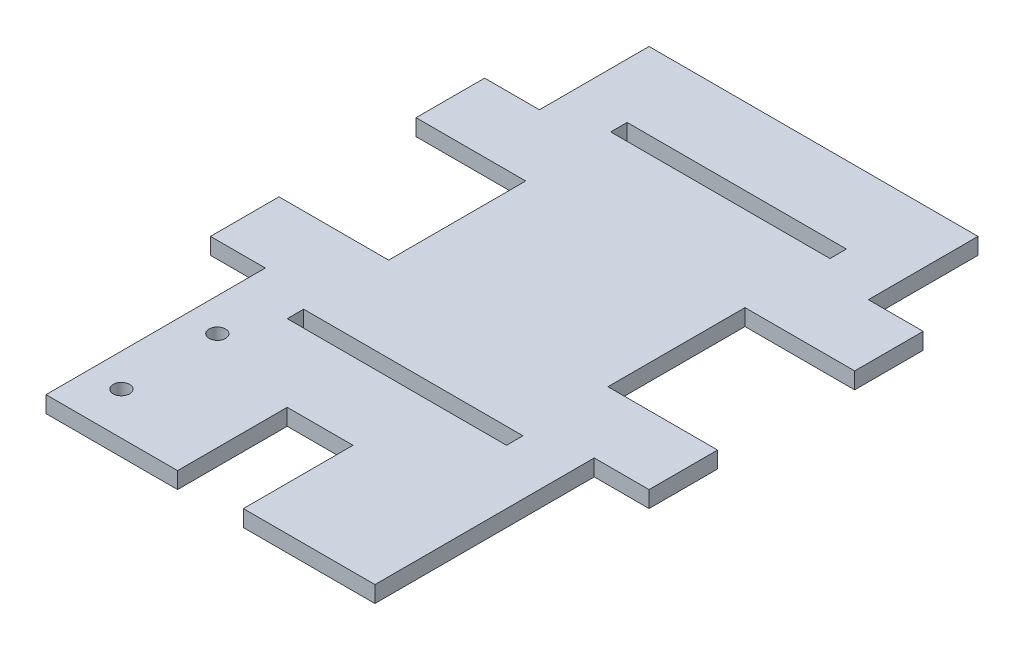
ISO-10303-21;
HEADER;
FILE_DESCRIPTION(('STEP AP214'),'2;1');
FILE_NAME('part.step','',(''),(''),'','','');
FILE_SCHEMA(('AUTOMOTIVE_DESIGN { 1 0 10303 214 1 1 1 1 }'));
ENDSEC;
DATA;
#1=APPLICATION_CONTEXT('core data for automotive mechanical design processes');
#2=APPLICATION_PROTOCOL_DEFINITION('international standard','automotive_design',2000,#1);
#3=PRODUCT_CONTEXT('',#1,'mechanical');
#4=PRODUCT('Part','Part','',(#3));
#5=PRODUCT_RELATED_PRODUCT_CATEGORY('part','',(#4));
#6=PRODUCT_DEFINITION_FORMATION('','',#4);
#7=PRODUCT_DEFINITION_CONTEXT('part definition',#1,'design');
#8=PRODUCT_DEFINITION('design','',#6,#7);
#9=PRODUCT_DEFINITION_SHAPE('','',#8);
#10=(LENGTH_UNIT() NAMED_UNIT(*) SI_UNIT(.MILLI.,.METRE.));
#11=(NAMED_UNIT(*) PLANE_ANGLE_UNIT() SI_UNIT($,.RADIAN.));
#12=(NAMED_UNIT(*) SI_UNIT($,.STERADIAN.) SOLID_ANGLE_UNIT());
#13=UNCERTAINTY_MEASURE_WITH_UNIT(LENGTH_MEASURE(1.E-05),#10,'distance_accuracy_value','');
#14=(GEOMETRIC_REPRESENTATION_CONTEXT(3) GLOBAL_UNCERTAINTY_ASSIGNED_CONTEXT((#13)) GLOBAL_UNIT_ASSIGNED_CONTEXT((#10,
#11,#12)) REPRESENTATION_CONTEXT('',''));
#15=CARTESIAN_POINT('',(0.,0.,0.));
#16=DIRECTION('',(0.,0.,1.));
#17=DIRECTION('',(1.,0.,0.));
#18=AXIS2_PLACEMENT_3D('',#15,#16,#17);
#19=CARTESIAN_POINT('',(0.,3.,40.));
#20=DIRECTION('',(0.,0.,-1.));
#21=DIRECTION('',(-1.,0.,0.));
#22=AXIS2_PLACEMENT_3D('',#19,#20,#21);
#23=PLANE('',#22);
#24=DIRECTION('',(0.,-1.,0.));
#25=VECTOR('',#24,1.);
#26=CARTESIAN_POINT('',(46.,10.,40.));
#27=LINE('',#26,#25);
#28=CARTESIAN_POINT('',(46.,3.,40.));
#29=VERTEX_POINT('',#28);
#30=CARTESIAN_POINT('',(46.,0.,40.));
#31=VERTEX_POINT('',#30);
#32=EDGE_CURVE('E466',#29,#31,#27,.T.);
#33=ORIENTED_EDGE('',*,*,#32,.T.);
#34=DIRECTION('',(1.,0.,0.));
#35=VECTOR('',#34,1.);
#36=CARTESIAN_POINT('',(0.,0.,40.));
#37=LINE('',#36,#35);
#38=CARTESIAN_POINT('',(70.,0.,40.));
#39=VERTEX_POINT('',#38);
#40=EDGE_CURVE('E396',#31,#39,#37,.T.);
#41=ORIENTED_EDGE('',*,*,#40,.T.);
#42=DIRECTION('',(0.,-1.,0.));
#43=VECTOR('',#42,1.);
#44=CARTESIAN_POINT('',(70.,3.,40.));
#45=LINE('',#44,#43);
#46=CARTESIAN_POINT('',(70.,3.,40.));
#47=VERTEX_POINT('',#46);
#48=EDGE_CURVE('E357',#47,#39,#45,.T.);
#49=ORIENTED_EDGE('',*,*,#48,.F.);
#50=DIRECTION('',(1.,0.,0.));
#51=VECTOR('',#50,1.);
#52=CARTESIAN_POINT('',(0.,3.,40.));
#53=LINE('',#52,#51);
#54=EDGE_CURVE('E465',#29,#47,#53,.T.);
#55=ORIENTED_EDGE('',*,*,#54,.F.);
#56=EDGE_LOOP('',(#33,#41,#49,#55));
#57=FACE_BOUND('',#56,.T.);
#58=ADVANCED_FACE('F41',(#57),#23,.F.);
#59=CARTESIAN_POINT('',(70.,3.,0.));
#60=DIRECTION('',(-1.,0.,0.));
#61=DIRECTION('',(0.,0.,1.));
#62=AXIS2_PLACEMENT_3D('',#59,#60,#61);
#63=PLANE('',#62);
#64=DIRECTION('',(0.,-1.,0.));
#65=VECTOR('',#64,1.);
#66=CARTESIAN_POINT('',(70.,10.,-70.));
#67=LINE('',#66,#65);
#68=CARTESIAN_POINT('',(70.,3.,-70.));
#69=VERTEX_POINT('',#68);
#70=CARTESIAN_POINT('',(70.,0.,-70.));
#71=VERTEX_POINT('',#70);
#72=EDGE_CURVE('E66',#69,#71,#67,.T.);
#73=ORIENTED_EDGE('',*,*,#72,.F.);
#74=DIRECTION('',(0.,0.,-1.));
#75=VECTOR('',#74,1.);
#76=CARTESIAN_POINT('',(70.,3.,0.));
#77=LINE('',#76,#75);
#78=CARTESIAN_POINT('',(70.,3.,-50.));
#79=VERTEX_POINT('',#78);
#80=EDGE_CURVE('E518',#79,#69,#77,.T.);
#81=ORIENTED_EDGE('',*,*,#80,.F.);
#82=DIRECTION('',(0.,-1.,0.));
#83=VECTOR('',#82,1.);
#84=CARTESIAN_POINT('',(70.,3.,-50.));
#85=LINE('',#84,#83);
#86=CARTESIAN_POINT('',(70.,0.,-50.));
#87=VERTEX_POINT('',#86);
#88=EDGE_CURVE('E338',#79,#87,#85,.T.);
#89=ORIENTED_EDGE('',*,*,#88,.T.);
#90=DIRECTION('',(0.,0.,-1.));
#91=VECTOR('',#90,1.);
#92=CARTESIAN_POINT('',(70.,0.,0.));
#93=LINE('',#92,#91);
#94=EDGE_CURVE('E274',#87,#71,#93,.T.);
#95=ORIENTED_EDGE('',*,*,#94,.T.);
#96=EDGE_LOOP('',(#73,#81,#89,#95));
#97=FACE_BOUND('',#96,.T.);
#98=ADVANCED_FACE('F580',(#97),#63,.F.);
#99=CARTESIAN_POINT('',(9.99999999999999,3.,0.));
#100=DIRECTION('',(-1.,0.,0.));
#101=DIRECTION('',(0.,0.,1.));
#102=AXIS2_PLACEMENT_3D('',#99,#100,#101);
#103=PLANE('',#102);
#104=DIRECTION('',(0.,0.,-1.));
#105=VECTOR('',#104,1.);
#106=CARTESIAN_POINT('',(9.99999999999999,3.,0.));
#107=LINE('',#106,#105);
#108=CARTESIAN_POINT('',(10.,3.,-50.));
#109=VERTEX_POINT('',#108);
#110=CARTESIAN_POINT('',(10.,3.,-70.));
#111=VERTEX_POINT('',#110);
#112=EDGE_CURVE('E268',#109,#111,#107,.T.);
#113=ORIENTED_EDGE('',*,*,#112,.T.);
#114=DIRECTION('',(0.,-1.,0.));
#115=VECTOR('',#114,1.);
#116=CARTESIAN_POINT('',(10.,10.,-70.));
#117=LINE('',#116,#115);
#118=CARTESIAN_POINT('',(10.,0.,-70.));
#119=VERTEX_POINT('',#118);
#120=EDGE_CURVE('E253',#111,#119,#117,.T.);
#121=ORIENTED_EDGE('',*,*,#120,.T.);
#122=DIRECTION('',(0.,0.,-1.));
#123=VECTOR('',#122,1.);
#124=CARTESIAN_POINT('',(9.99999999999999,0.,0.));
#125=LINE('',#124,#123);
#126=CARTESIAN_POINT('',(10.,0.,-50.));
#127=VERTEX_POINT('',#126);
#128=EDGE_CURVE('E265',#127,#119,#125,.T.);
#129=ORIENTED_EDGE('',*,*,#128,.F.);
#130=DIRECTION('',(0.,-1.,0.));
#131=VECTOR('',#130,1.);
#132=CARTESIAN_POINT('',(10.,3.,-50.));
#133=LINE('',#132,#131);
#134=EDGE_CURVE('E336',#109,#127,#133,.T.);
#135=ORIENTED_EDGE('',*,*,#134,.F.);
#136=EDGE_LOOP('',(#113,#121,#129,#135));
#137=FACE_BOUND('',#136,.T.);
#138=ADVANCED_FACE('F264',(#137),#103,.T.);
#139=CARTESIAN_POINT('',(0.,3.,0.));
#140=DIRECTION('',(0.,1.,0.));
#141=DIRECTION('',(0.,0.,1.));
#142=AXIS2_PLACEMENT_3D('',#139,#140,#141);
#143=PLANE('',#142);
#144=CARTESIAN_POINT('',(16.,3.,14.75));
#145=DIRECTION('',(0.,1.,0.));
#146=DIRECTION('',(0.,0.,1.));
#147=AXIS2_PLACEMENT_3D('',#144,#145,#146);
#148=CIRCLE('',#147,1.5);
#149=CARTESIAN_POINT('',(16.,3.,16.25));
#150=VERTEX_POINT('',#149);
#151=EDGE_CURVE('E492',#150,#150,#148,.F.);
#152=ORIENTED_EDGE('',*,*,#151,.T.);
#153=EDGE_LOOP('',(#152));
#154=FACE_BOUND('',#153,.T.);
#155=DIRECTION('',(1.,0.,0.));
#156=VECTOR('',#155,1.);
#157=CARTESIAN_POINT('',(0.,3.,3.));
#158=LINE('',#157,#156);
#159=CARTESIAN_POINT('',(20.,3.,3.));
#160=VERTEX_POINT('',#159);
#161=CARTESIAN_POINT('',(60.,3.,3.));
#162=VERTEX_POINT('',#161);
#163=EDGE_CURVE('E530',#160,#162,#158,.T.);
#164=ORIENTED_EDGE('',*,*,#163,.T.);
#165=DIRECTION('',(0.,0.,1.));
#166=VECTOR('',#165,1.);
#167=CARTESIAN_POINT('',(60.,3.,1.38777878078145E-13));
#168=LINE('',#167,#166);
#169=CARTESIAN_POINT('',(60.,3.,6.));
#170=VERTEX_POINT('',#169);
#171=EDGE_CURVE('E533',#162,#170,#168,.T.);
#172=ORIENTED_EDGE('',*,*,#171,.T.);
#173=DIRECTION('',(1.,0.,0.));
#174=VECTOR('',#173,1.);
#175=CARTESIAN_POINT('',(0.,3.,6.));
#176=LINE('',#175,#174);
#177=CARTESIAN_POINT('',(20.,3.,6.));
#178=VERTEX_POINT('',#177);
#179=EDGE_CURVE('E535',#178,#170,#176,.T.);
#180=ORIENTED_EDGE('',*,*,#179,.F.);
#181=DIRECTION('',(0.,0.,1.));
#182=VECTOR('',#181,1.);
#183=CARTESIAN_POINT('',(20.,3.,0.));
#184=LINE('',#183,#182);
#185=EDGE_CURVE('E538',#160,#178,#184,.T.);
#186=ORIENTED_EDGE('',*,*,#185,.F.);
#187=EDGE_LOOP('',(#164,#172,#180,#186));
#188=FACE_BOUND('',#187,.T.);
#189=DIRECTION('',(0.,0.,-1.));
#190=VECTOR('',#189,1.);
#191=CARTESIAN_POINT('',(19.9999999999999,3.,0.));
#192=LINE('',#191,#190);
#193=CARTESIAN_POINT('',(20.,3.,-53.));
#194=VERTEX_POINT('',#193);
#195=CARTESIAN_POINT('',(20.,3.,-56.));
#196=VERTEX_POINT('',#195);
#197=EDGE_CURVE('E541',#194,#196,#192,.T.);
#198=ORIENTED_EDGE('',*,*,#197,.T.);
#199=DIRECTION('',(1.,0.,0.));
#200=VECTOR('',#199,1.);
#201=CARTESIAN_POINT('',(0.,3.,-56.));
#202=LINE('',#201,#200);
#203=CARTESIAN_POINT('',(60.,3.,-56.));
#204=VERTEX_POINT('',#203);
#205=EDGE_CURVE('E544',#196,#204,#202,.T.);
#206=ORIENTED_EDGE('',*,*,#205,.T.);
#207=DIRECTION('',(0.,0.,-1.));
#208=VECTOR('',#207,1.);
#209=CARTESIAN_POINT('',(60.0000000000001,3.,-1.38777878078145E-13));
#210=LINE('',#209,#208);
#211=CARTESIAN_POINT('',(60.,3.,-53.));
#212=VERTEX_POINT('',#211);
#213=EDGE_CURVE('E546',#212,#204,#210,.T.);
#214=ORIENTED_EDGE('',*,*,#213,.F.);
#215=DIRECTION('',(1.,0.,0.));
#216=VECTOR('',#215,1.);
#217=CARTESIAN_POINT('',(0.,3.,-53.));
#218=LINE('',#217,#216);
#219=EDGE_CURVE('E329',#194,#212,#218,.T.);
#220=ORIENTED_EDGE('',*,*,#219,.F.);
#221=EDGE_LOOP('',(#198,#206,#214,#220));
#222=FACE_BOUND('',#221,.T.);
#223=CARTESIAN_POINT('',(16.,3.,32.25));
#224=DIRECTION('',(0.,1.,0.));
#225=DIRECTION('',(0.,0.,1.));
#226=AXIS2_PLACEMENT_3D('',#223,#224,#225);
#227=CIRCLE('',#226,1.5);
#228=CARTESIAN_POINT('',(16.,3.,33.75));
#229=VERTEX_POINT('',#228);
#230=EDGE_CURVE('E495',#229,#229,#227,.F.);
#231=ORIENTED_EDGE('',*,*,#230,.T.);
#232=EDGE_LOOP('',(#231));
#233=FACE_BOUND('',#232,.T.);
#234=ORIENTED_EDGE('',*,*,#80,.T.);
#235=DIRECTION('',(-1.,0.,0.));
#236=VECTOR('',#235,1.);
#237=CARTESIAN_POINT('',(0.,3.,-70.));
#238=LINE('',#237,#236);
#239=EDGE_CURVE('E385',#69,#111,#238,.T.);
#240=ORIENTED_EDGE('',*,*,#239,.T.);
#241=ORIENTED_EDGE('',*,*,#112,.F.);
#242=DIRECTION('',(1.,0.,0.));
#243=VECTOR('',#242,1.);
#244=CARTESIAN_POINT('',(0.,3.,-50.));
#245=LINE('',#244,#243);
#246=CARTESIAN_POINT('',(0.,3.,-50.));
#247=VERTEX_POINT('',#246);
#248=EDGE_CURVE('E519',#247,#109,#245,.T.);
#249=ORIENTED_EDGE('',*,*,#248,.F.);
#250=DIRECTION('',(0.,0.,-1.));
#251=VECTOR('',#250,1.);
#252=CARTESIAN_POINT('',(0.,3.,0.));
#253=LINE('',#252,#251);
#254=CARTESIAN_POINT('',(0.,3.,-37.5));
#255=VERTEX_POINT('',#254);
#256=EDGE_CURVE('E523',#255,#247,#253,.T.);
#257=ORIENTED_EDGE('',*,*,#256,.F.);
#258=DIRECTION('',(1.,0.,0.));
#259=VECTOR('',#258,1.);
#260=CARTESIAN_POINT('',(0.,3.,-37.5));
#261=LINE('',#260,#259);
#262=CARTESIAN_POINT('',(20.,3.,-37.5));
#263=VERTEX_POINT('',#262);
#264=EDGE_CURVE('E526',#255,#263,#261,.T.);
#265=ORIENTED_EDGE('',*,*,#264,.T.);
#266=DIRECTION('',(0.,0.,1.));
#267=VECTOR('',#266,1.);
#268=CARTESIAN_POINT('',(20.,3.,0.));
#269=LINE('',#268,#267);
#270=CARTESIAN_POINT('',(20.,3.,-12.5));
#271=VERTEX_POINT('',#270);
#272=EDGE_CURVE('E528',#263,#271,#269,.T.);
#273=ORIENTED_EDGE('',*,*,#272,.T.);
#274=DIRECTION('',(1.,0.,0.));
#275=VECTOR('',#274,1.);
#276=CARTESIAN_POINT('',(0.,3.,-12.5));
#277=LINE('',#276,#275);
#278=CARTESIAN_POINT('',(0.,3.,-12.5));
#279=VERTEX_POINT('',#278);
#280=EDGE_CURVE('E311',#279,#271,#277,.T.);
#281=ORIENTED_EDGE('',*,*,#280,.F.);
#282=DIRECTION('',(0.,0.,-1.));
#283=VECTOR('',#282,1.);
#284=CARTESIAN_POINT('',(0.,3.,0.));
#285=LINE('',#284,#283);
#286=CARTESIAN_POINT('',(0.,3.,0.));
#287=VERTEX_POINT('',#286);
#288=EDGE_CURVE('E377',#287,#279,#285,.T.);
#289=ORIENTED_EDGE('',*,*,#288,.F.);
#290=DIRECTION('',(1.,0.,0.));
#291=VECTOR('',#290,1.);
#292=CARTESIAN_POINT('',(0.,3.,0.));
#293=LINE('',#292,#291);
#294=CARTESIAN_POINT('',(10.,3.,0.));
#295=VERTEX_POINT('',#294);
#296=EDGE_CURVE('E501',#287,#295,#293,.T.);
#297=ORIENTED_EDGE('',*,*,#296,.T.);
#298=DIRECTION('',(0.,0.,1.));
#299=VECTOR('',#298,1.);
#300=CARTESIAN_POINT('',(10.,3.,0.));
#301=LINE('',#300,#299);
#302=CARTESIAN_POINT('',(10.,3.,40.));
#303=VERTEX_POINT('',#302);
#304=EDGE_CURVE('E503',#295,#303,#301,.T.);
#305=ORIENTED_EDGE('',*,*,#304,.T.);
#306=CARTESIAN_POINT('',(34.,3.,40.));
#307=VERTEX_POINT('',#306);
#308=EDGE_CURVE('E506',#303,#307,#53,.T.);
#309=ORIENTED_EDGE('',*,*,#308,.T.);
#310=DIRECTION('',(0.,0.,1.));
#311=VECTOR('',#310,1.);
#312=CARTESIAN_POINT('',(34.,3.,0.));
#313=LINE('',#312,#311);
#314=CARTESIAN_POINT('',(34.,3.,20.));
#315=VERTEX_POINT('',#314);
#316=EDGE_CURVE('E490',#315,#307,#313,.T.);
#317=ORIENTED_EDGE('',*,*,#316,.F.);
#318=DIRECTION('',(-1.,0.,0.));
#319=VECTOR('',#318,1.);
#320=CARTESIAN_POINT('',(0.,3.,20.));
#321=LINE('',#320,#319);
#322=CARTESIAN_POINT('',(46.,3.,20.));
#323=VERTEX_POINT('',#322);
#324=EDGE_CURVE('E485',#323,#315,#321,.T.);
#325=ORIENTED_EDGE('',*,*,#324,.F.);
#326=DIRECTION('',(0.,0.,1.));
#327=VECTOR('',#326,1.);
#328=CARTESIAN_POINT('',(46.,3.,0.));
#329=LINE('',#328,#327);
#330=EDGE_CURVE('E487',#323,#29,#329,.T.);
#331=ORIENTED_EDGE('',*,*,#330,.T.);
#332=ORIENTED_EDGE('',*,*,#54,.T.);
#333=DIRECTION('',(0.,0.,1.));
#334=VECTOR('',#333,1.);
#335=CARTESIAN_POINT('',(70.,3.,0.));
#336=LINE('',#335,#334);
#337=CARTESIAN_POINT('',(70.,3.,0.));
#338=VERTEX_POINT('',#337);
#339=EDGE_CURVE('E461',#338,#47,#336,.T.);
#340=ORIENTED_EDGE('',*,*,#339,.F.);
#341=CARTESIAN_POINT('',(80.,3.,0.));
#342=VERTEX_POINT('',#341);
#343=EDGE_CURVE('E504',#338,#342,#293,.T.);
#344=ORIENTED_EDGE('',*,*,#343,.T.);
#345=DIRECTION('',(0.,0.,-1.));
#346=VECTOR('',#345,1.);
#347=CARTESIAN_POINT('',(80.,3.,0.));
#348=LINE('',#347,#346);
#349=CARTESIAN_POINT('',(80.,3.,-12.5));
#350=VERTEX_POINT('',#349);
#351=EDGE_CURVE('E510',#342,#350,#348,.T.);
#352=ORIENTED_EDGE('',*,*,#351,.T.);
#353=DIRECTION('',(1.,0.,0.));
#354=VECTOR('',#353,1.);
#355=CARTESIAN_POINT('',(0.,3.,-12.5));
#356=LINE('',#355,#354);
#357=CARTESIAN_POINT('',(60.,3.,-12.5));
#358=VERTEX_POINT('',#357);
#359=EDGE_CURVE('E446',#358,#350,#356,.T.);
#360=ORIENTED_EDGE('',*,*,#359,.F.);
#361=DIRECTION('',(0.,0.,-1.));
#362=VECTOR('',#361,1.);
#363=CARTESIAN_POINT('',(60.,3.,0.));
#364=LINE('',#363,#362);
#365=CARTESIAN_POINT('',(60.,3.,-37.5));
#366=VERTEX_POINT('',#365);
#367=EDGE_CURVE('E513',#358,#366,#364,.T.);
#368=ORIENTED_EDGE('',*,*,#367,.T.);
#369=DIRECTION('',(1.,0.,0.));
#370=VECTOR('',#369,1.);
#371=CARTESIAN_POINT('',(0.,3.,-37.5));
#372=LINE('',#371,#370);
#373=CARTESIAN_POINT('',(80.,3.,-37.5));
#374=VERTEX_POINT('',#373);
#375=EDGE_CURVE('E434',#366,#374,#372,.T.);
#376=ORIENTED_EDGE('',*,*,#375,.T.);
#377=DIRECTION('',(0.,0.,-1.));
#378=VECTOR('',#377,1.);
#379=CARTESIAN_POINT('',(80.,3.,0.));
#380=LINE('',#379,#378);
#381=CARTESIAN_POINT('',(80.,3.,-50.));
#382=VERTEX_POINT('',#381);
#383=EDGE_CURVE('E430',#374,#382,#380,.T.);
#384=ORIENTED_EDGE('',*,*,#383,.T.);
#385=EDGE_CURVE('E425',#79,#382,#245,.T.);
#386=ORIENTED_EDGE('',*,*,#385,.F.);
#387=EDGE_LOOP('',(#234,#240,#241,#249,#257,#265,#273,#281,#289,#297,#305,#309,#317,#325,#331,
#332,#340,#344,#352,#360,#368,#376,#384,#386));
#388=FACE_BOUND('',#387,.T.);
#389=ADVANCED_FACE('F557',(#154,#188,#222,#233,#388),#143,.T.);
#390=CARTESIAN_POINT('',(0.,0.,0.));
#391=DIRECTION('',(0.,1.,0.));
#392=DIRECTION('',(0.,0.,1.));
#393=AXIS2_PLACEMENT_3D('',#390,#391,#392);
#394=PLANE('',#393);
#395=CARTESIAN_POINT('',(16.,0.,32.25));
#396=DIRECTION('',(0.,1.,0.));
#397=DIRECTION('',(0.,0.,1.));
#398=AXIS2_PLACEMENT_3D('',#395,#396,#397);
#399=CIRCLE('',#398,1.5);
#400=CARTESIAN_POINT('',(16.,0.,33.75));
#401=VERTEX_POINT('',#400);
#402=EDGE_CURVE('E259',#401,#401,#399,.T.);
#403=ORIENTED_EDGE('',*,*,#402,.T.);
#404=EDGE_LOOP('',(#403));
#405=FACE_BOUND('',#404,.T.);
#406=CARTESIAN_POINT('',(16.,0.,14.75));
#407=DIRECTION('',(0.,1.,0.));
#408=DIRECTION('',(0.,0.,1.));
#409=AXIS2_PLACEMENT_3D('',#406,#407,#408);
#410=CIRCLE('',#409,1.5);
#411=CARTESIAN_POINT('',(16.,0.,16.25));
#412=VERTEX_POINT('',#411);
#413=EDGE_CURVE('E625',#412,#412,#410,.T.);
#414=ORIENTED_EDGE('',*,*,#413,.T.);
#415=EDGE_LOOP('',(#414));
#416=FACE_BOUND('',#415,.T.);
#417=DIRECTION('',(0.,0.,-1.));
#418=VECTOR('',#417,1.);
#419=CARTESIAN_POINT('',(19.9999999999999,0.,0.));
#420=LINE('',#419,#418);
#421=CARTESIAN_POINT('',(20.,0.,-53.));
#422=VERTEX_POINT('',#421);
#423=CARTESIAN_POINT('',(20.,0.,-56.));
#424=VERTEX_POINT('',#423);
#425=EDGE_CURVE('E299',#422,#424,#420,.T.);
#426=ORIENTED_EDGE('',*,*,#425,.F.);
#427=DIRECTION('',(1.,0.,0.));
#428=VECTOR('',#427,1.);
#429=CARTESIAN_POINT('',(0.,0.,-53.));
#430=LINE('',#429,#428);
#431=CARTESIAN_POINT('',(60.,0.,-53.));
#432=VERTEX_POINT('',#431);
#433=EDGE_CURVE('E308',#422,#432,#430,.T.);
#434=ORIENTED_EDGE('',*,*,#433,.T.);
#435=DIRECTION('',(0.,0.,-1.));
#436=VECTOR('',#435,1.);
#437=CARTESIAN_POINT('',(60.0000000000001,0.,-1.38777878078145E-13));
#438=LINE('',#437,#436);
#439=CARTESIAN_POINT('',(60.,0.,-56.));
#440=VERTEX_POINT('',#439);
#441=EDGE_CURVE('E305',#432,#440,#438,.T.);
#442=ORIENTED_EDGE('',*,*,#441,.T.);
#443=DIRECTION('',(1.,0.,0.));
#444=VECTOR('',#443,1.);
#445=CARTESIAN_POINT('',(0.,0.,-56.));
#446=LINE('',#445,#444);
#447=EDGE_CURVE('E302',#424,#440,#446,.T.);
#448=ORIENTED_EDGE('',*,*,#447,.F.);
#449=EDGE_LOOP('',(#426,#434,#442,#448));
#450=FACE_BOUND('',#449,.T.);
#451=DIRECTION('',(1.,0.,0.));
#452=VECTOR('',#451,1.);
#453=CARTESIAN_POINT('',(0.,0.,3.));
#454=LINE('',#453,#452);
#455=CARTESIAN_POINT('',(20.,0.,3.));
#456=VERTEX_POINT('',#455);
#457=CARTESIAN_POINT('',(60.,0.,3.));
#458=VERTEX_POINT('',#457);
#459=EDGE_CURVE('E287',#456,#458,#454,.T.);
#460=ORIENTED_EDGE('',*,*,#459,.F.);
#461=DIRECTION('',(0.,0.,1.));
#462=VECTOR('',#461,1.);
#463=CARTESIAN_POINT('',(20.,0.,0.));
#464=LINE('',#463,#462);
#465=CARTESIAN_POINT('',(20.,0.,6.));
#466=VERTEX_POINT('',#465);
#467=EDGE_CURVE('E296',#456,#466,#464,.T.);
#468=ORIENTED_EDGE('',*,*,#467,.T.);
#469=DIRECTION('',(1.,0.,0.));
#470=VECTOR('',#469,1.);
#471=CARTESIAN_POINT('',(0.,0.,6.));
#472=LINE('',#471,#470);
#473=CARTESIAN_POINT('',(60.,0.,6.));
#474=VERTEX_POINT('',#473);
#475=EDGE_CURVE('E293',#466,#474,#472,.T.);
#476=ORIENTED_EDGE('',*,*,#475,.T.);
#477=DIRECTION('',(0.,0.,1.));
#478=VECTOR('',#477,1.);
#479=CARTESIAN_POINT('',(60.,0.,1.38777878078145E-13));
#480=LINE('',#479,#478);
#481=EDGE_CURVE('E290',#458,#474,#480,.T.);
#482=ORIENTED_EDGE('',*,*,#481,.F.);
#483=EDGE_LOOP('',(#460,#468,#476,#482));
#484=FACE_BOUND('',#483,.T.);
#485=DIRECTION('',(1.,0.,0.));
#486=VECTOR('',#485,1.);
#487=CARTESIAN_POINT('',(0.,0.,-70.));
#488=LINE('',#487,#486);
#489=EDGE_CURVE('E250',#119,#71,#488,.T.);
#490=ORIENTED_EDGE('',*,*,#489,.T.);
#491=ORIENTED_EDGE('',*,*,#94,.F.);
#492=DIRECTION('',(1.,0.,0.));
#493=VECTOR('',#492,1.);
#494=CARTESIAN_POINT('',(0.,0.,-50.));
#495=LINE('',#494,#493);
#496=CARTESIAN_POINT('',(80.,0.,-50.));
#497=VERTEX_POINT('',#496);
#498=EDGE_CURVE('E278',#87,#497,#495,.T.);
#499=ORIENTED_EDGE('',*,*,#498,.T.);
#500=DIRECTION('',(0.,0.,-1.));
#501=VECTOR('',#500,1.);
#502=CARTESIAN_POINT('',(80.,0.,0.));
#503=LINE('',#502,#501);
#504=CARTESIAN_POINT('',(80.,0.,-37.5));
#505=VERTEX_POINT('',#504);
#506=EDGE_CURVE('E413',#505,#497,#503,.T.);
#507=ORIENTED_EDGE('',*,*,#506,.F.);
#508=DIRECTION('',(1.,0.,0.));
#509=VECTOR('',#508,1.);
#510=CARTESIAN_POINT('',(0.,0.,-37.5));
#511=LINE('',#510,#509);
#512=CARTESIAN_POINT('',(60.,0.,-37.5));
#513=VERTEX_POINT('',#512);
#514=EDGE_CURVE('E411',#513,#505,#511,.T.);
#515=ORIENTED_EDGE('',*,*,#514,.F.);
#516=DIRECTION('',(0.,0.,-1.));
#517=VECTOR('',#516,1.);
#518=CARTESIAN_POINT('',(60.,0.,0.));
#519=LINE('',#518,#517);
#520=CARTESIAN_POINT('',(60.,0.,-12.5));
#521=VERTEX_POINT('',#520);
#522=EDGE_CURVE('E409',#521,#513,#519,.T.);
#523=ORIENTED_EDGE('',*,*,#522,.F.);
#524=DIRECTION('',(1.,0.,0.));
#525=VECTOR('',#524,1.);
#526=CARTESIAN_POINT('',(0.,0.,-12.5));
#527=LINE('',#526,#525);
#528=CARTESIAN_POINT('',(80.,0.,-12.5));
#529=VERTEX_POINT('',#528);
#530=EDGE_CURVE('E406',#521,#529,#527,.T.);
#531=ORIENTED_EDGE('',*,*,#530,.T.);
#532=DIRECTION('',(0.,0.,-1.));
#533=VECTOR('',#532,1.);
#534=CARTESIAN_POINT('',(80.,0.,0.));
#535=LINE('',#534,#533);
#536=CARTESIAN_POINT('',(80.,0.,0.));
#537=VERTEX_POINT('',#536);
#538=EDGE_CURVE('E403',#537,#529,#535,.T.);
#539=ORIENTED_EDGE('',*,*,#538,.F.);
#540=DIRECTION('',(1.,0.,0.));
#541=VECTOR('',#540,1.);
#542=CARTESIAN_POINT('',(0.,0.,0.));
#543=LINE('',#542,#541);
#544=CARTESIAN_POINT('',(70.,0.,0.));
#545=VERTEX_POINT('',#544);
#546=EDGE_CURVE('E392',#545,#537,#543,.T.);
#547=ORIENTED_EDGE('',*,*,#546,.F.);
#548=DIRECTION('',(0.,0.,1.));
#549=VECTOR('',#548,1.);
#550=CARTESIAN_POINT('',(70.,0.,0.));
#551=LINE('',#550,#549);
#552=EDGE_CURVE('E400',#545,#39,#551,.T.);
#553=ORIENTED_EDGE('',*,*,#552,.T.);
#554=ORIENTED_EDGE('',*,*,#40,.F.);
#555=DIRECTION('',(0.,0.,-1.));
#556=VECTOR('',#555,1.);
#557=CARTESIAN_POINT('',(46.,0.,0.));
#558=LINE('',#557,#556);
#559=CARTESIAN_POINT('',(46.,0.,20.));
#560=VERTEX_POINT('',#559);
#561=EDGE_CURVE('E469',#31,#560,#558,.T.);
#562=ORIENTED_EDGE('',*,*,#561,.T.);
#563=DIRECTION('',(1.,0.,0.));
#564=VECTOR('',#563,1.);
#565=CARTESIAN_POINT('',(0.,0.,20.));
#566=LINE('',#565,#564);
#567=CARTESIAN_POINT('',(34.,0.,20.));
#568=VERTEX_POINT('',#567);
#569=EDGE_CURVE('E471',#568,#560,#566,.T.);
#570=ORIENTED_EDGE('',*,*,#569,.F.);
#571=DIRECTION('',(0.,0.,-1.));
#572=VECTOR('',#571,1.);
#573=CARTESIAN_POINT('',(34.,0.,0.));
#574=LINE('',#573,#572);
#575=CARTESIAN_POINT('',(34.,0.,40.));
#576=VERTEX_POINT('',#575);
#577=EDGE_CURVE('E58',#576,#568,#574,.T.);
#578=ORIENTED_EDGE('',*,*,#577,.F.);
#579=CARTESIAN_POINT('',(10.,0.,40.));
#580=VERTEX_POINT('',#579);
#581=EDGE_CURVE('E397',#580,#576,#37,.T.);
#582=ORIENTED_EDGE('',*,*,#581,.F.);
#583=DIRECTION('',(0.,0.,1.));
#584=VECTOR('',#583,1.);
#585=CARTESIAN_POINT('',(10.,0.,0.));
#586=LINE('',#585,#584);
#587=CARTESIAN_POINT('',(10.,0.,0.));
#588=VERTEX_POINT('',#587);
#589=EDGE_CURVE('E390',#588,#580,#586,.T.);
#590=ORIENTED_EDGE('',*,*,#589,.F.);
#591=CARTESIAN_POINT('',(0.,0.,0.));
#592=VERTEX_POINT('',#591);
#593=EDGE_CURVE('E388',#592,#588,#543,.T.);
#594=ORIENTED_EDGE('',*,*,#593,.F.);
#595=DIRECTION('',(0.,0.,-1.));
#596=VECTOR('',#595,1.);
#597=CARTESIAN_POINT('',(0.,0.,0.));
#598=LINE('',#597,#596);
#599=CARTESIAN_POINT('',(0.,0.,-12.5));
#600=VERTEX_POINT('',#599);
#601=EDGE_CURVE('E375',#592,#600,#598,.T.);
#602=ORIENTED_EDGE('',*,*,#601,.T.);
#603=DIRECTION('',(1.,0.,0.));
#604=VECTOR('',#603,1.);
#605=CARTESIAN_POINT('',(0.,0.,-12.5));
#606=LINE('',#605,#604);
#607=CARTESIAN_POINT('',(20.,0.,-12.5));
#608=VERTEX_POINT('',#607);
#609=EDGE_CURVE('E382',#600,#608,#606,.T.);
#610=ORIENTED_EDGE('',*,*,#609,.T.);
#611=DIRECTION('',(0.,0.,1.));
#612=VECTOR('',#611,1.);
#613=CARTESIAN_POINT('',(20.,0.,0.));
#614=LINE('',#613,#612);
#615=CARTESIAN_POINT('',(20.,0.,-37.5));
#616=VERTEX_POINT('',#615);
#617=EDGE_CURVE('E284',#616,#608,#614,.T.);
#618=ORIENTED_EDGE('',*,*,#617,.F.);
#619=DIRECTION('',(1.,0.,0.));
#620=VECTOR('',#619,1.);
#621=CARTESIAN_POINT('',(0.,0.,-37.5));
#622=LINE('',#621,#620);
#623=CARTESIAN_POINT('',(0.,0.,-37.5));
#624=VERTEX_POINT('',#623);
#625=EDGE_CURVE('E282',#624,#616,#622,.T.);
#626=ORIENTED_EDGE('',*,*,#625,.F.);
#627=DIRECTION('',(0.,0.,-1.));
#628=VECTOR('',#627,1.);
#629=CARTESIAN_POINT('',(0.,0.,0.));
#630=LINE('',#629,#628);
#631=CARTESIAN_POINT('',(0.,0.,-50.));
#632=VERTEX_POINT('',#631);
#633=EDGE_CURVE('E276',#624,#632,#630,.T.);
#634=ORIENTED_EDGE('',*,*,#633,.T.);
#635=EDGE_CURVE('E273',#632,#127,#495,.T.);
#636=ORIENTED_EDGE('',*,*,#635,.T.);
#637=ORIENTED_EDGE('',*,*,#128,.T.);
#638=EDGE_LOOP('',(#490,#491,#499,#507,#515,#523,#531,#539,#547,#553,#554,#562,#570,#578,#582,
#590,#594,#602,#610,#618,#626,#634,#636,#637));
#639=FACE_BOUND('',#638,.T.);
#640=ADVANCED_FACE('F270',(#405,#416,#450,#484,#639),#394,.F.);
#641=CARTESIAN_POINT('',(19.9999999999999,3.,0.));
#642=DIRECTION('',(-1.,0.,0.));
#643=DIRECTION('',(0.,0.,1.));
#644=AXIS2_PLACEMENT_3D('',#641,#642,#643);
#645=PLANE('',#644);
#646=ORIENTED_EDGE('',*,*,#425,.T.);
#647=DIRECTION('',(0.,-1.,0.));
#648=VECTOR('',#647,1.);
#649=CARTESIAN_POINT('',(20.,3.,-56.));
#650=LINE('',#649,#648);
#651=EDGE_CURVE('E11',#196,#424,#650,.T.);
#652=ORIENTED_EDGE('',*,*,#651,.F.);
#653=ORIENTED_EDGE('',*,*,#197,.F.);
#654=DIRECTION('',(0.,-1.,0.));
#655=VECTOR('',#654,1.);
#656=CARTESIAN_POINT('',(20.,3.,-53.));
#657=LINE('',#656,#655);
#658=EDGE_CURVE('E312',#194,#422,#657,.T.);
#659=ORIENTED_EDGE('',*,*,#658,.T.);
#660=EDGE_LOOP('',(#646,#652,#653,#659));
#661=FACE_BOUND('',#660,.T.);
#662=ADVANCED_FACE('F567',(#661),#645,.F.);
#663=CARTESIAN_POINT('',(0.,3.,-56.));
#664=DIRECTION('',(0.,0.,-1.));
#665=DIRECTION('',(-1.,0.,0.));
#666=AXIS2_PLACEMENT_3D('',#663,#664,#665);
#667=PLANE('',#666);
#668=ORIENTED_EDGE('',*,*,#447,.T.);
#669=DIRECTION('',(0.,-1.,0.));
#670=VECTOR('',#669,1.);
#671=CARTESIAN_POINT('',(60.,3.,-56.));
#672=LINE('',#671,#670);
#673=EDGE_CURVE('E50',#204,#440,#672,.T.);
#674=ORIENTED_EDGE('',*,*,#673,.F.);
#675=ORIENTED_EDGE('',*,*,#205,.F.);
#676=ORIENTED_EDGE('',*,*,#651,.T.);
#677=EDGE_LOOP('',(#668,#674,#675,#676));
#678=FACE_BOUND('',#677,.T.);
#679=ADVANCED_FACE('F569',(#678),#667,.F.);
#680=CARTESIAN_POINT('',(60.0000000000001,3.,-1.38777878078145E-13));
#681=DIRECTION('',(-1.,0.,0.));
#682=DIRECTION('',(0.,0.,1.));
#683=AXIS2_PLACEMENT_3D('',#680,#681,#682);
#684=PLANE('',#683);
#685=ORIENTED_EDGE('',*,*,#441,.F.);
#686=DIRECTION('',(0.,-1.,0.));
#687=VECTOR('',#686,1.);
#688=CARTESIAN_POINT('',(60.,3.,-53.));
#689=LINE('',#688,#687);
#690=EDGE_CURVE('E314',#212,#432,#689,.T.);
#691=ORIENTED_EDGE('',*,*,#690,.F.);
#692=ORIENTED_EDGE('',*,*,#213,.T.);
#693=ORIENTED_EDGE('',*,*,#673,.T.);
#694=EDGE_LOOP('',(#685,#691,#692,#693));
#695=FACE_BOUND('',#694,.T.);
#696=ADVANCED_FACE('F562',(#695),#684,.T.);
#697=CARTESIAN_POINT('',(0.,3.,3.));
#698=DIRECTION('',(0.,0.,-1.));
#699=DIRECTION('',(-1.,0.,0.));
#700=AXIS2_PLACEMENT_3D('',#697,#698,#699);
#701=PLANE('',#700);
#702=ORIENTED_EDGE('',*,*,#459,.T.);
#703=DIRECTION('',(0.,-1.,0.));
#704=VECTOR('',#703,1.);
#705=CARTESIAN_POINT('',(60.,3.,3.));
#706=LINE('',#705,#704);
#707=EDGE_CURVE('E315',#162,#458,#706,.T.);
#708=ORIENTED_EDGE('',*,*,#707,.F.);
#709=ORIENTED_EDGE('',*,*,#163,.F.);
#710=DIRECTION('',(0.,-1.,0.));
#711=VECTOR('',#710,1.);
#712=CARTESIAN_POINT('',(20.,3.,3.));
#713=LINE('',#712,#711);
#714=EDGE_CURVE('E318',#160,#456,#713,.T.);
#715=ORIENTED_EDGE('',*,*,#714,.T.);
#716=EDGE_LOOP('',(#702,#708,#709,#715));
#717=FACE_BOUND('',#716,.T.);
#718=ADVANCED_FACE('F576',(#717),#701,.F.);
#719=CARTESIAN_POINT('',(60.,3.,1.38777878078145E-13));
#720=DIRECTION('',(1.,0.,0.));
#721=DIRECTION('',(0.,0.,-1.));
#722=AXIS2_PLACEMENT_3D('',#719,#720,#721);
#723=PLANE('',#722);
#724=ORIENTED_EDGE('',*,*,#481,.T.);
#725=DIRECTION('',(0.,-1.,0.));
#726=VECTOR('',#725,1.);
#727=CARTESIAN_POINT('',(60.,3.,6.));
#728=LINE('',#727,#726);
#729=EDGE_CURVE('E322',#170,#474,#728,.T.);
#730=ORIENTED_EDGE('',*,*,#729,.F.);
#731=ORIENTED_EDGE('',*,*,#171,.F.);
#732=ORIENTED_EDGE('',*,*,#707,.T.);
#733=EDGE_LOOP('',(#724,#730,#731,#732));
#734=FACE_BOUND('',#733,.T.);
#735=ADVANCED_FACE('F709',(#734),#723,.F.);
#736=CARTESIAN_POINT('',(0.,3.,6.));
#737=DIRECTION('',(0.,0.,-1.));
#738=DIRECTION('',(-1.,0.,0.));
#739=AXIS2_PLACEMENT_3D('',#736,#737,#738);
#740=PLANE('',#739);
#741=ORIENTED_EDGE('',*,*,#475,.F.);
#742=DIRECTION('',(0.,-1.,0.));
#743=VECTOR('',#742,1.);
#744=CARTESIAN_POINT('',(20.,3.,6.));
#745=LINE('',#744,#743);
#746=EDGE_CURVE('E320',#178,#466,#745,.T.);
#747=ORIENTED_EDGE('',*,*,#746,.F.);
#748=ORIENTED_EDGE('',*,*,#179,.T.);
#749=ORIENTED_EDGE('',*,*,#729,.T.);
#750=EDGE_LOOP('',(#741,#747,#748,#749));
#751=FACE_BOUND('',#750,.T.);
#752=ADVANCED_FACE('F705',(#751),#740,.T.);
#753=CARTESIAN_POINT('',(0.,3.,-12.5));
#754=DIRECTION('',(0.,0.,-1.));
#755=DIRECTION('',(-1.,0.,0.));
#756=AXIS2_PLACEMENT_3D('',#753,#754,#755);
#757=PLANE('',#756);
#758=ORIENTED_EDGE('',*,*,#609,.F.);
#759=DIRECTION('',(0.,-1.,0.));
#760=VECTOR('',#759,1.);
#761=CARTESIAN_POINT('',(0.,3.,-12.5));
#762=LINE('',#761,#760);
#763=EDGE_CURVE('E45',#279,#600,#762,.T.);
#764=ORIENTED_EDGE('',*,*,#763,.F.);
#765=ORIENTED_EDGE('',*,*,#280,.T.);
#766=DIRECTION('',(0.,-1.,0.));
#767=VECTOR('',#766,1.);
#768=CARTESIAN_POINT('',(20.,3.,-12.5));
#769=LINE('',#768,#767);
#770=EDGE_CURVE('E326',#271,#608,#769,.T.);
#771=ORIENTED_EDGE('',*,*,#770,.T.);
#772=EDGE_LOOP('',(#758,#764,#765,#771));
#773=FACE_BOUND('',#772,.T.);
#774=ADVANCED_FACE('F43',(#773),#757,.T.);
#775=CARTESIAN_POINT('',(0.,3.,0.));
#776=DIRECTION('',(-1.,0.,0.));
#777=DIRECTION('',(0.,0.,1.));
#778=AXIS2_PLACEMENT_3D('',#775,#776,#777);
#779=PLANE('',#778);
#780=ORIENTED_EDGE('',*,*,#601,.F.);
#781=DIRECTION('',(0.,-1.,0.));
#782=VECTOR('',#781,1.);
#783=CARTESIAN_POINT('',(0.,3.,0.));
#784=LINE('',#783,#782);
#785=EDGE_CURVE('E365',#287,#592,#784,.T.);
#786=ORIENTED_EDGE('',*,*,#785,.F.);
#787=ORIENTED_EDGE('',*,*,#288,.T.);
#788=ORIENTED_EDGE('',*,*,#763,.T.);
#789=EDGE_LOOP('',(#780,#786,#787,#788));
#790=FACE_BOUND('',#789,.T.);
#791=ADVANCED_FACE('F373',(#790),#779,.T.);
#792=CARTESIAN_POINT('',(0.,3.,0.));
#793=DIRECTION('',(0.,0.,-1.));
#794=DIRECTION('',(-1.,0.,0.));
#795=AXIS2_PLACEMENT_3D('',#792,#793,#794);
#796=PLANE('',#795);
#797=ORIENTED_EDGE('',*,*,#593,.T.);
#798=DIRECTION('',(0.,-1.,0.));
#799=VECTOR('',#798,1.);
#800=CARTESIAN_POINT('',(10.,3.,0.));
#801=LINE('',#800,#799);
#802=EDGE_CURVE('E363',#295,#588,#801,.T.);
#803=ORIENTED_EDGE('',*,*,#802,.F.);
#804=ORIENTED_EDGE('',*,*,#296,.F.);
#805=ORIENTED_EDGE('',*,*,#785,.T.);
#806=EDGE_LOOP('',(#797,#803,#804,#805));
#807=FACE_BOUND('',#806,.T.);
#808=ADVANCED_FACE('F598',(#807),#796,.F.);
#809=CARTESIAN_POINT('',(10.,3.,0.));
#810=DIRECTION('',(1.,0.,0.));
#811=DIRECTION('',(0.,0.,-1.));
#812=AXIS2_PLACEMENT_3D('',#809,#810,#811);
#813=PLANE('',#812);
#814=ORIENTED_EDGE('',*,*,#589,.T.);
#815=DIRECTION('',(0.,-1.,0.));
#816=VECTOR('',#815,1.);
#817=CARTESIAN_POINT('',(10.,3.,40.));
#818=LINE('',#817,#816);
#819=EDGE_CURVE('E360',#303,#580,#818,.T.);
#820=ORIENTED_EDGE('',*,*,#819,.F.);
#821=ORIENTED_EDGE('',*,*,#304,.F.);
#822=ORIENTED_EDGE('',*,*,#802,.T.);
#823=EDGE_LOOP('',(#814,#820,#821,#822));
#824=FACE_BOUND('',#823,.T.);
#825=ADVANCED_FACE('F591',(#824),#813,.F.);
#826=ORIENTED_EDGE('',*,*,#581,.T.);
#827=DIRECTION('',(0.,-1.,0.));
#828=VECTOR('',#827,1.);
#829=CARTESIAN_POINT('',(34.,10.,40.));
#830=LINE('',#829,#828);
#831=EDGE_CURVE('E483',#307,#576,#830,.T.);
#832=ORIENTED_EDGE('',*,*,#831,.F.);
#833=ORIENTED_EDGE('',*,*,#308,.F.);
#834=ORIENTED_EDGE('',*,*,#819,.T.);
#835=EDGE_LOOP('',(#826,#832,#833,#834));
#836=FACE_BOUND('',#835,.T.);
#837=ADVANCED_FACE('F582',(#836),#23,.F.);
#838=CARTESIAN_POINT('',(70.,3.,0.));
#839=DIRECTION('',(1.,0.,0.));
#840=DIRECTION('',(0.,0.,-1.));
#841=AXIS2_PLACEMENT_3D('',#838,#839,#840);
#842=PLANE('',#841);
#843=ORIENTED_EDGE('',*,*,#552,.F.);
#844=DIRECTION('',(0.,-1.,0.));
#845=VECTOR('',#844,1.);
#846=CARTESIAN_POINT('',(70.,3.,0.));
#847=LINE('',#846,#845);
#848=EDGE_CURVE('E355',#338,#545,#847,.T.);
#849=ORIENTED_EDGE('',*,*,#848,.F.);
#850=ORIENTED_EDGE('',*,*,#339,.T.);
#851=ORIENTED_EDGE('',*,*,#48,.T.);
#852=EDGE_LOOP('',(#843,#849,#850,#851));
#853=FACE_BOUND('',#852,.T.);
#854=ADVANCED_FACE('F456',(#853),#842,.T.);
#855=ORIENTED_EDGE('',*,*,#546,.T.);
#856=DIRECTION('',(0.,-1.,0.));
#857=VECTOR('',#856,1.);
#858=CARTESIAN_POINT('',(80.,3.,0.));
#859=LINE('',#858,#857);
#860=EDGE_CURVE('E352',#342,#537,#859,.T.);
#861=ORIENTED_EDGE('',*,*,#860,.F.);
#862=ORIENTED_EDGE('',*,*,#343,.F.);
#863=ORIENTED_EDGE('',*,*,#848,.T.);
#864=EDGE_LOOP('',(#855,#861,#862,#863));
#865=FACE_BOUND('',#864,.T.);
#866=ADVANCED_FACE('F597',(#865),#796,.F.);
#867=CARTESIAN_POINT('',(80.,3.,0.));
#868=DIRECTION('',(-1.,0.,0.));
#869=DIRECTION('',(0.,0.,1.));
#870=AXIS2_PLACEMENT_3D('',#867,#868,#869);
#871=PLANE('',#870);
#872=ORIENTED_EDGE('',*,*,#538,.T.);
#873=DIRECTION('',(0.,-1.,0.));
#874=VECTOR('',#873,1.);
#875=CARTESIAN_POINT('',(80.,3.,-12.5));
#876=LINE('',#875,#874);
#877=EDGE_CURVE('E350',#350,#529,#876,.T.);
#878=ORIENTED_EDGE('',*,*,#877,.F.);
#879=ORIENTED_EDGE('',*,*,#351,.F.);
#880=ORIENTED_EDGE('',*,*,#860,.T.);
#881=EDGE_LOOP('',(#872,#878,#879,#880));
#882=FACE_BOUND('',#881,.T.);
#883=ADVANCED_FACE('F449',(#882),#871,.F.);
#884=CARTESIAN_POINT('',(0.,3.,-12.5));
#885=DIRECTION('',(0.,0.,-1.));
#886=DIRECTION('',(-1.,0.,0.));
#887=AXIS2_PLACEMENT_3D('',#884,#885,#886);
#888=PLANE('',#887);
#889=ORIENTED_EDGE('',*,*,#530,.F.);
#890=DIRECTION('',(0.,-1.,0.));
#891=VECTOR('',#890,1.);
#892=CARTESIAN_POINT('',(60.,3.,-12.5));
#893=LINE('',#892,#891);
#894=EDGE_CURVE('E348',#358,#521,#893,.T.);
#895=ORIENTED_EDGE('',*,*,#894,.F.);
#896=ORIENTED_EDGE('',*,*,#359,.T.);
#897=ORIENTED_EDGE('',*,*,#877,.T.);
#898=EDGE_LOOP('',(#889,#895,#896,#897));
#899=FACE_BOUND('',#898,.T.);
#900=ADVANCED_FACE('F441',(#899),#888,.T.);
#901=CARTESIAN_POINT('',(60.,3.,0.));
#902=DIRECTION('',(-1.,0.,0.));
#903=DIRECTION('',(0.,0.,1.));
#904=AXIS2_PLACEMENT_3D('',#901,#902,#903);
#905=PLANE('',#904);
#906=ORIENTED_EDGE('',*,*,#522,.T.);
#907=DIRECTION('',(0.,-1.,0.));
#908=VECTOR('',#907,1.);
#909=CARTESIAN_POINT('',(60.,3.,-37.5));
#910=LINE('',#909,#908);
#911=EDGE_CURVE('E345',#366,#513,#910,.T.);
#912=ORIENTED_EDGE('',*,*,#911,.F.);
#913=ORIENTED_EDGE('',*,*,#367,.F.);
#914=ORIENTED_EDGE('',*,*,#894,.T.);
#915=EDGE_LOOP('',(#906,#912,#913,#914));
#916=FACE_BOUND('',#915,.T.);
#917=ADVANCED_FACE('F688',(#916),#905,.F.);
#918=CARTESIAN_POINT('',(0.,3.,-37.5));
#919=DIRECTION('',(0.,0.,-1.));
#920=DIRECTION('',(-1.,0.,0.));
#921=AXIS2_PLACEMENT_3D('',#918,#919,#920);
#922=PLANE('',#921);
#923=ORIENTED_EDGE('',*,*,#514,.T.);
#924=DIRECTION('',(0.,-1.,0.));
#925=VECTOR('',#924,1.);
#926=CARTESIAN_POINT('',(80.,3.,-37.5));
#927=LINE('',#926,#925);
#928=EDGE_CURVE('E342',#374,#505,#927,.T.);
#929=ORIENTED_EDGE('',*,*,#928,.F.);
#930=ORIENTED_EDGE('',*,*,#375,.F.);
#931=ORIENTED_EDGE('',*,*,#911,.T.);
#932=EDGE_LOOP('',(#923,#929,#930,#931));
#933=FACE_BOUND('',#932,.T.);
#934=ADVANCED_FACE('F433',(#933),#922,.F.);
#935=CARTESIAN_POINT('',(80.,3.,0.));
#936=DIRECTION('',(-1.,0.,0.));
#937=DIRECTION('',(0.,0.,1.));
#938=AXIS2_PLACEMENT_3D('',#935,#936,#937);
#939=PLANE('',#938);
#940=ORIENTED_EDGE('',*,*,#506,.T.);
#941=DIRECTION('',(0.,-1.,0.));
#942=VECTOR('',#941,1.);
#943=CARTESIAN_POINT('',(80.,3.,-50.));
#944=LINE('',#943,#942);
#945=EDGE_CURVE('E340',#382,#497,#944,.T.);
#946=ORIENTED_EDGE('',*,*,#945,.F.);
#947=ORIENTED_EDGE('',*,*,#383,.F.);
#948=ORIENTED_EDGE('',*,*,#928,.T.);
#949=EDGE_LOOP('',(#940,#946,#947,#948));
#950=FACE_BOUND('',#949,.T.);
#951=ADVANCED_FACE('F428',(#950),#939,.F.);
#952=CARTESIAN_POINT('',(0.,3.,-50.));
#953=DIRECTION('',(0.,0.,-1.));
#954=DIRECTION('',(-1.,0.,0.));
#955=AXIS2_PLACEMENT_3D('',#952,#953,#954);
#956=PLANE('',#955);
#957=ORIENTED_EDGE('',*,*,#498,.F.);
#958=ORIENTED_EDGE('',*,*,#88,.F.);
#959=ORIENTED_EDGE('',*,*,#385,.T.);
#960=ORIENTED_EDGE('',*,*,#945,.T.);
#961=EDGE_LOOP('',(#957,#958,#959,#960));
#962=FACE_BOUND('',#961,.T.);
#963=ADVANCED_FACE('F420',(#962),#956,.T.);
#964=ORIENTED_EDGE('',*,*,#635,.F.);
#965=DIRECTION('',(0.,-1.,0.));
#966=VECTOR('',#965,1.);
#967=CARTESIAN_POINT('',(0.,3.,-50.));
#968=LINE('',#967,#966);
#969=EDGE_CURVE('E334',#247,#632,#968,.T.);
#970=ORIENTED_EDGE('',*,*,#969,.F.);
#971=ORIENTED_EDGE('',*,*,#248,.T.);
#972=ORIENTED_EDGE('',*,*,#134,.T.);
#973=EDGE_LOOP('',(#964,#970,#971,#972));
#974=FACE_BOUND('',#973,.T.);
#975=ADVANCED_FACE('F621',(#974),#956,.T.);
#976=CARTESIAN_POINT('',(0.,3.,0.));
#977=DIRECTION('',(-1.,0.,0.));
#978=DIRECTION('',(0.,0.,1.));
#979=AXIS2_PLACEMENT_3D('',#976,#977,#978);
#980=PLANE('',#979);
#981=ORIENTED_EDGE('',*,*,#633,.F.);
#982=DIRECTION('',(0.,-1.,0.));
#983=VECTOR('',#982,1.);
#984=CARTESIAN_POINT('',(0.,3.,-37.5));
#985=LINE('',#984,#983);
#986=EDGE_CURVE('E332',#255,#624,#985,.T.);
#987=ORIENTED_EDGE('',*,*,#986,.F.);
#988=ORIENTED_EDGE('',*,*,#256,.T.);
#989=ORIENTED_EDGE('',*,*,#969,.T.);
#990=EDGE_LOOP('',(#981,#987,#988,#989));
#991=FACE_BOUND('',#990,.T.);
#992=ADVANCED_FACE('F617',(#991),#980,.T.);
#993=CARTESIAN_POINT('',(0.,3.,-37.5));
#994=DIRECTION('',(0.,0.,-1.));
#995=DIRECTION('',(-1.,0.,0.));
#996=AXIS2_PLACEMENT_3D('',#993,#994,#995);
#997=PLANE('',#996);
#998=ORIENTED_EDGE('',*,*,#625,.T.);
#999=DIRECTION('',(0.,-1.,0.));
#1000=VECTOR('',#999,1.);
#1001=CARTESIAN_POINT('',(20.,3.,-37.5));
#1002=LINE('',#1001,#1000);
#1003=EDGE_CURVE('E328',#263,#616,#1002,.T.);
#1004=ORIENTED_EDGE('',*,*,#1003,.F.);
#1005=ORIENTED_EDGE('',*,*,#264,.F.);
#1006=ORIENTED_EDGE('',*,*,#986,.T.);
#1007=EDGE_LOOP('',(#998,#1004,#1005,#1006));
#1008=FACE_BOUND('',#1007,.T.);
#1009=ADVANCED_FACE('F670',(#1008),#997,.F.);
#1010=CARTESIAN_POINT('',(20.,3.,0.));
#1011=DIRECTION('',(1.,0.,0.));
#1012=DIRECTION('',(0.,0.,-1.));
#1013=AXIS2_PLACEMENT_3D('',#1010,#1011,#1012);
#1014=PLANE('',#1013);
#1015=ORIENTED_EDGE('',*,*,#467,.F.);
#1016=ORIENTED_EDGE('',*,*,#714,.F.);
#1017=ORIENTED_EDGE('',*,*,#185,.T.);
#1018=ORIENTED_EDGE('',*,*,#746,.T.);
#1019=EDGE_LOOP('',(#1015,#1016,#1017,#1018));
#1020=FACE_BOUND('',#1019,.T.);
#1021=ADVANCED_FACE('F665',(#1020),#1014,.T.);
#1022=CARTESIAN_POINT('',(20.,3.,0.));
#1023=DIRECTION('',(1.,0.,0.));
#1024=DIRECTION('',(0.,0.,-1.));
#1025=AXIS2_PLACEMENT_3D('',#1022,#1023,#1024);
#1026=PLANE('',#1025);
#1027=ORIENTED_EDGE('',*,*,#617,.T.);
#1028=ORIENTED_EDGE('',*,*,#770,.F.);
#1029=ORIENTED_EDGE('',*,*,#272,.F.);
#1030=ORIENTED_EDGE('',*,*,#1003,.T.);
#1031=EDGE_LOOP('',(#1027,#1028,#1029,#1030));
#1032=FACE_BOUND('',#1031,.T.);
#1033=ADVANCED_FACE('F612',(#1032),#1026,.F.);
#1034=CARTESIAN_POINT('',(0.,3.,-53.));
#1035=DIRECTION('',(0.,0.,-1.));
#1036=DIRECTION('',(-1.,0.,0.));
#1037=AXIS2_PLACEMENT_3D('',#1034,#1035,#1036);
#1038=PLANE('',#1037);
#1039=ORIENTED_EDGE('',*,*,#433,.F.);
#1040=ORIENTED_EDGE('',*,*,#658,.F.);
#1041=ORIENTED_EDGE('',*,*,#219,.T.);
#1042=ORIENTED_EDGE('',*,*,#690,.T.);
#1043=EDGE_LOOP('',(#1039,#1040,#1041,#1042));
#1044=FACE_BOUND('',#1043,.T.);
#1045=ADVANCED_FACE('F552',(#1044),#1038,.T.);
#1046=CARTESIAN_POINT('',(34.,10.,0.));
#1047=DIRECTION('',(-1.,0.,0.));
#1048=DIRECTION('',(0.,0.,1.));
#1049=AXIS2_PLACEMENT_3D('',#1046,#1047,#1048);
#1050=PLANE('',#1049);
#1051=ORIENTED_EDGE('',*,*,#316,.T.);
#1052=ORIENTED_EDGE('',*,*,#831,.T.);
#1053=ORIENTED_EDGE('',*,*,#577,.T.);
#1054=DIRECTION('',(0.,-1.,0.));
#1055=VECTOR('',#1054,1.);
#1056=CARTESIAN_POINT('',(34.,10.,20.));
#1057=LINE('',#1056,#1055);
#1058=EDGE_CURVE('E474',#315,#568,#1057,.T.);
#1059=ORIENTED_EDGE('',*,*,#1058,.F.);
#1060=EDGE_LOOP('',(#1051,#1052,#1053,#1059));
#1061=FACE_BOUND('',#1060,.T.);
#1062=ADVANCED_FACE('F653',(#1061),#1050,.F.);
#1063=CARTESIAN_POINT('',(46.,10.,0.));
#1064=DIRECTION('',(-1.,0.,0.));
#1065=DIRECTION('',(0.,0.,1.));
#1066=AXIS2_PLACEMENT_3D('',#1063,#1064,#1065);
#1067=PLANE('',#1066);
#1068=DIRECTION('',(0.,-1.,0.));
#1069=VECTOR('',#1068,1.);
#1070=CARTESIAN_POINT('',(46.,10.,20.));
#1071=LINE('',#1070,#1069);
#1072=EDGE_CURVE('E480',#323,#560,#1071,.T.);
#1073=ORIENTED_EDGE('',*,*,#1072,.T.);
#1074=ORIENTED_EDGE('',*,*,#561,.F.);
#1075=ORIENTED_EDGE('',*,*,#32,.F.);
#1076=ORIENTED_EDGE('',*,*,#330,.F.);
#1077=EDGE_LOOP('',(#1073,#1074,#1075,#1076));
#1078=FACE_BOUND('',#1077,.T.);
#1079=ADVANCED_FACE('F644',(#1078),#1067,.T.);
#1080=CARTESIAN_POINT('',(0.,10.,20.));
#1081=DIRECTION('',(0.,0.,-1.));
#1082=DIRECTION('',(-1.,0.,0.));
#1083=AXIS2_PLACEMENT_3D('',#1080,#1081,#1082);
#1084=PLANE('',#1083);
#1085=ORIENTED_EDGE('',*,*,#324,.T.);
#1086=ORIENTED_EDGE('',*,*,#1058,.T.);
#1087=ORIENTED_EDGE('',*,*,#569,.T.);
#1088=ORIENTED_EDGE('',*,*,#1072,.F.);
#1089=EDGE_LOOP('',(#1085,#1086,#1087,#1088));
#1090=FACE_BOUND('',#1089,.T.);
#1091=ADVANCED_FACE('F635',(#1090),#1084,.F.);
#1092=CARTESIAN_POINT('',(16.,10.,14.75));
#1093=DIRECTION('',(0.,-1.,0.));
#1094=DIRECTION('',(0.,0.,-1.));
#1095=AXIS2_PLACEMENT_3D('',#1092,#1093,#1094);
#1096=CYLINDRICAL_SURFACE('',#1095,1.5);
#1097=ORIENTED_EDGE('',*,*,#151,.F.);
#1098=EDGE_LOOP('',(#1097));
#1099=FACE_BOUND('',#1098,.T.);
#1100=ORIENTED_EDGE('',*,*,#413,.F.);
#1101=EDGE_LOOP('',(#1100));
#1102=FACE_BOUND('',#1101,.T.);
#1103=ADVANCED_FACE('F632',(#1099,#1102),#1096,.F.);
#1104=CARTESIAN_POINT('',(16.,10.,32.25));
#1105=DIRECTION('',(0.,-1.,0.));
#1106=DIRECTION('',(0.,0.,-1.));
#1107=AXIS2_PLACEMENT_3D('',#1104,#1105,#1106);
#1108=CYLINDRICAL_SURFACE('',#1107,1.5);
#1109=ORIENTED_EDGE('',*,*,#230,.F.);
#1110=EDGE_LOOP('',(#1109));
#1111=FACE_BOUND('',#1110,.T.);
#1112=ORIENTED_EDGE('',*,*,#402,.F.);
#1113=EDGE_LOOP('',(#1112));
#1114=FACE_BOUND('',#1113,.T.);
#1115=ADVANCED_FACE('F634',(#1111,#1114),#1108,.F.);
#1116=CARTESIAN_POINT('',(0.,10.,-70.));
#1117=DIRECTION('',(0.,0.,-1.));
#1118=DIRECTION('',(-1.,0.,0.));
#1119=AXIS2_PLACEMENT_3D('',#1116,#1117,#1118);
#1120=PLANE('',#1119);
#1121=ORIENTED_EDGE('',*,*,#72,.T.);
#1122=ORIENTED_EDGE('',*,*,#489,.F.);
#1123=ORIENTED_EDGE('',*,*,#120,.F.);
#1124=ORIENTED_EDGE('',*,*,#239,.F.);
#1125=EDGE_LOOP('',(#1121,#1122,#1123,#1124));
#1126=FACE_BOUND('',#1125,.T.);
#1127=ADVANCED_FACE('F252',(#1126),#1120,.T.);
#1128=CLOSED_SHELL('',(#58,#98,#138,#389,#640,#662,#679,#696,#718,#735,#752,#774,#791,#808,#825,
#837,#854,#866,#883,#900,#917,#934,#951,#963,#975,#992,#1009,#1021,#1033,#1045,#1062,#1079,
#1091,#1103,#1115,#1127));
#1129=MANIFOLD_SOLID_BREP('B2',#1128);
#1130=ADVANCED_BREP_SHAPE_REPRESENTATION('',(#18,#1129),#14);
#1131=SHAPE_DEFINITION_REPRESENTATION(#9,#1130);
ENDSEC;
END-ISO-10303-21;
